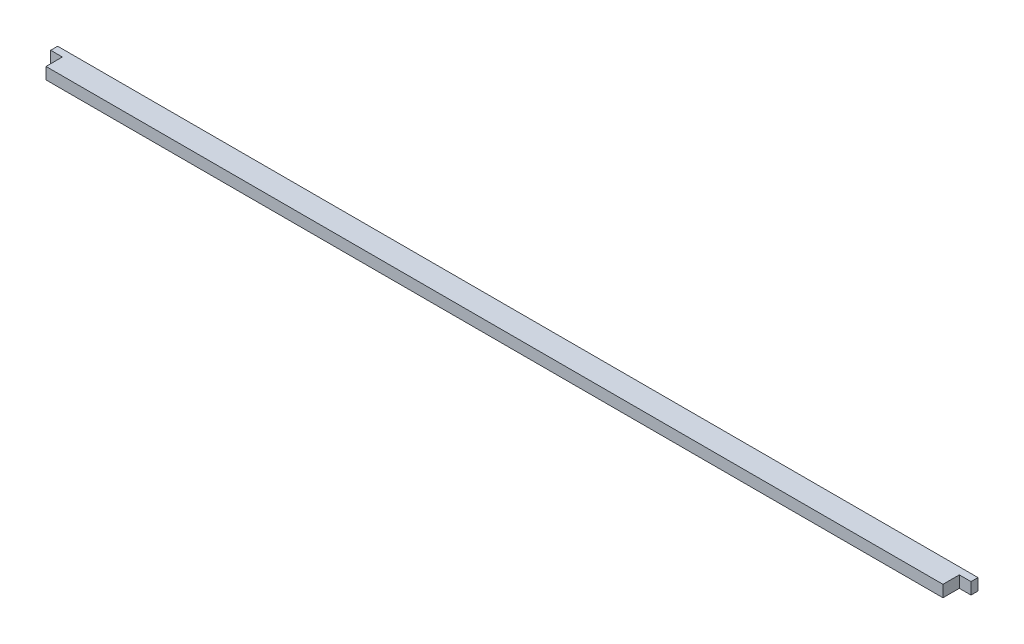
ISO-10303-21;
HEADER;
FILE_DESCRIPTION(('STEP AP214'),'2;1');
FILE_NAME('part.step','',(''),(''),'','','');
FILE_SCHEMA(('AUTOMOTIVE_DESIGN { 1 0 10303 214 1 1 1 1 }'));
ENDSEC;
DATA;
#1=APPLICATION_CONTEXT('core data for automotive mechanical design processes');
#2=APPLICATION_PROTOCOL_DEFINITION('international standard','automotive_design',2000,#1);
#3=PRODUCT_CONTEXT('',#1,'mechanical');
#4=PRODUCT('Part','Part','',(#3));
#5=PRODUCT_RELATED_PRODUCT_CATEGORY('part','',(#4));
#6=PRODUCT_DEFINITION_FORMATION('','',#4);
#7=PRODUCT_DEFINITION_CONTEXT('part definition',#1,'design');
#8=PRODUCT_DEFINITION('design','',#6,#7);
#9=PRODUCT_DEFINITION_SHAPE('','',#8);
#10=(LENGTH_UNIT() NAMED_UNIT(*) SI_UNIT(.MILLI.,.METRE.));
#11=(NAMED_UNIT(*) PLANE_ANGLE_UNIT() SI_UNIT($,.RADIAN.));
#12=(NAMED_UNIT(*) SI_UNIT($,.STERADIAN.) SOLID_ANGLE_UNIT());
#13=UNCERTAINTY_MEASURE_WITH_UNIT(LENGTH_MEASURE(1.E-05),#10,'distance_accuracy_value','');
#14=(GEOMETRIC_REPRESENTATION_CONTEXT(3) GLOBAL_UNCERTAINTY_ASSIGNED_CONTEXT((#13)) GLOBAL_UNIT_ASSIGNED_CONTEXT((#10,
#11,#12)) REPRESENTATION_CONTEXT('',''));
#15=CARTESIAN_POINT('',(0.,0.,0.));
#16=DIRECTION('',(0.,0.,1.));
#17=DIRECTION('',(1.,0.,0.));
#18=AXIS2_PLACEMENT_3D('',#15,#16,#17);
#19=CARTESIAN_POINT('',(-218.948369565217,5.,72.7078804347826));
#20=DIRECTION('',(1.,0.,0.));
#21=DIRECTION('',(0.,0.,-1.));
#22=AXIS2_PLACEMENT_3D('',#19,#20,#21);
#23=PLANE('',#22);
#24=DIRECTION('',(0.,0.,1.));
#25=VECTOR('',#24,1.);
#26=CARTESIAN_POINT('',(-218.948369565217,0.,72.7078804347826));
#27=LINE('',#26,#25);
#28=CARTESIAN_POINT('',(-218.948369565217,0.,72.7078804347826));
#29=VERTEX_POINT('',#28);
#30=CARTESIAN_POINT('',(-218.948369565217,0.,75.7078804347826));
#31=VERTEX_POINT('',#30);
#32=EDGE_CURVE('E119',#29,#31,#27,.T.);
#33=ORIENTED_EDGE('',*,*,#32,.T.);
#34=DIRECTION('',(0.,1.,0.));
#35=VECTOR('',#34,1.);
#36=CARTESIAN_POINT('',(-218.948369565217,0.,75.7078804347826));
#37=LINE('',#36,#35);
#38=CARTESIAN_POINT('',(-218.948369565217,5.,75.7078804347826));
#39=VERTEX_POINT('',#38);
#40=EDGE_CURVE('E124',#31,#39,#37,.T.);
#41=ORIENTED_EDGE('',*,*,#40,.T.);
#42=DIRECTION('',(0.,0.,1.));
#43=VECTOR('',#42,1.);
#44=CARTESIAN_POINT('',(-218.948369565217,5.,72.7078804347826));
#45=LINE('',#44,#43);
#46=CARTESIAN_POINT('',(-218.948369565217,5.,72.7078804347826));
#47=VERTEX_POINT('',#46);
#48=EDGE_CURVE('E128',#47,#39,#45,.T.);
#49=ORIENTED_EDGE('',*,*,#48,.F.);
#50=DIRECTION('',(0.,-1.,0.));
#51=VECTOR('',#50,1.);
#52=CARTESIAN_POINT('',(-218.948369565217,5.,72.7078804347826));
#53=LINE('',#52,#51);
#54=EDGE_CURVE('E40',#47,#29,#53,.T.);
#55=ORIENTED_EDGE('',*,*,#54,.T.);
#56=EDGE_LOOP('',(#33,#41,#49,#55));
#57=FACE_BOUND('',#56,.T.);
#58=ADVANCED_FACE('F33',(#57),#23,.F.);
#59=CARTESIAN_POINT('',(-218.948369565217,5.,82.7078804347826));
#60=DIRECTION('',(0.,0.,-1.));
#61=DIRECTION('',(-1.,0.,0.));
#62=AXIS2_PLACEMENT_3D('',#59,#60,#61);
#63=PLANE('',#62);
#64=DIRECTION('',(1.,0.,0.));
#65=VECTOR('',#64,1.);
#66=CARTESIAN_POINT('',(-218.948369565217,5.,82.7078804347826));
#67=LINE('',#66,#65);
#68=CARTESIAN_POINT('',(-213.948369565217,5.,82.7078804347826));
#69=VERTEX_POINT('',#68);
#70=CARTESIAN_POINT('',(170.051630434783,5.,82.7078804347826));
#71=VERTEX_POINT('',#70);
#72=EDGE_CURVE('E114',#69,#71,#67,.T.);
#73=ORIENTED_EDGE('',*,*,#72,.F.);
#74=DIRECTION('',(0.,1.,0.));
#75=VECTOR('',#74,1.);
#76=CARTESIAN_POINT('',(-213.948369565217,0.,82.7078804347826));
#77=LINE('',#76,#75);
#78=CARTESIAN_POINT('',(-213.948369565217,0.,82.7078804347826));
#79=VERTEX_POINT('',#78);
#80=EDGE_CURVE('E100',#79,#69,#77,.T.);
#81=ORIENTED_EDGE('',*,*,#80,.F.);
#82=DIRECTION('',(1.,0.,0.));
#83=VECTOR('',#82,1.);
#84=CARTESIAN_POINT('',(-218.948369565217,0.,82.7078804347826));
#85=LINE('',#84,#83);
#86=CARTESIAN_POINT('',(170.051630434783,0.,82.7078804347826));
#87=VERTEX_POINT('',#86);
#88=EDGE_CURVE('E112',#79,#87,#85,.T.);
#89=ORIENTED_EDGE('',*,*,#88,.T.);
#90=DIRECTION('',(0.,1.,0.));
#91=VECTOR('',#90,1.);
#92=CARTESIAN_POINT('',(170.051630434783,0.,82.7078804347826));
#93=LINE('',#92,#91);
#94=EDGE_CURVE('E147',#87,#71,#93,.T.);
#95=ORIENTED_EDGE('',*,*,#94,.T.);
#96=EDGE_LOOP('',(#73,#81,#89,#95));
#97=FACE_BOUND('',#96,.T.);
#98=ADVANCED_FACE('F110',(#97),#63,.F.);
#99=CARTESIAN_POINT('',(175.051630434783,5.,72.7078804347826));
#100=DIRECTION('',(-1.,0.,0.));
#101=DIRECTION('',(0.,0.,1.));
#102=AXIS2_PLACEMENT_3D('',#99,#100,#101);
#103=PLANE('',#102);
#104=DIRECTION('',(0.,0.,-1.));
#105=VECTOR('',#104,1.);
#106=CARTESIAN_POINT('',(175.051630434783,5.,72.7078804347826));
#107=LINE('',#106,#105);
#108=CARTESIAN_POINT('',(175.051630434783,5.,75.7078804347826));
#109=VERTEX_POINT('',#108);
#110=CARTESIAN_POINT('',(175.051630434783,5.,72.7078804347826));
#111=VERTEX_POINT('',#110);
#112=EDGE_CURVE('E135',#109,#111,#107,.T.);
#113=ORIENTED_EDGE('',*,*,#112,.F.);
#114=DIRECTION('',(0.,1.,0.));
#115=VECTOR('',#114,1.);
#116=CARTESIAN_POINT('',(175.051630434783,0.,75.7078804347826));
#117=LINE('',#116,#115);
#118=CARTESIAN_POINT('',(175.051630434783,0.,75.7078804347826));
#119=VERTEX_POINT('',#118);
#120=EDGE_CURVE('E143',#119,#109,#117,.T.);
#121=ORIENTED_EDGE('',*,*,#120,.F.);
#122=DIRECTION('',(0.,0.,-1.));
#123=VECTOR('',#122,1.);
#124=CARTESIAN_POINT('',(175.051630434783,0.,72.7078804347826));
#125=LINE('',#124,#123);
#126=CARTESIAN_POINT('',(175.051630434783,0.,72.7078804347826));
#127=VERTEX_POINT('',#126);
#128=EDGE_CURVE('E118',#119,#127,#125,.T.);
#129=ORIENTED_EDGE('',*,*,#128,.T.);
#130=DIRECTION('',(0.,-1.,0.));
#131=VECTOR('',#130,1.);
#132=CARTESIAN_POINT('',(175.051630434783,5.,72.7078804347826));
#133=LINE('',#132,#131);
#134=EDGE_CURVE('E11',#111,#127,#133,.T.);
#135=ORIENTED_EDGE('',*,*,#134,.F.);
#136=EDGE_LOOP('',(#113,#121,#129,#135));
#137=FACE_BOUND('',#136,.T.);
#138=ADVANCED_FACE('F182',(#137),#103,.F.);
#139=CARTESIAN_POINT('',(-218.948369565217,5.,72.7078804347826));
#140=DIRECTION('',(0.,0.,1.));
#141=DIRECTION('',(1.,0.,0.));
#142=AXIS2_PLACEMENT_3D('',#139,#140,#141);
#143=PLANE('',#142);
#144=DIRECTION('',(-1.,0.,0.));
#145=VECTOR('',#144,1.);
#146=CARTESIAN_POINT('',(-218.948369565217,0.,72.7078804347826));
#147=LINE('',#146,#145);
#148=EDGE_CURVE('E121',#127,#29,#147,.T.);
#149=ORIENTED_EDGE('',*,*,#148,.T.);
#150=ORIENTED_EDGE('',*,*,#54,.F.);
#151=DIRECTION('',(-1.,0.,0.));
#152=VECTOR('',#151,1.);
#153=CARTESIAN_POINT('',(-218.948369565217,5.,72.7078804347826));
#154=LINE('',#153,#152);
#155=EDGE_CURVE('E130',#111,#47,#154,.T.);
#156=ORIENTED_EDGE('',*,*,#155,.F.);
#157=ORIENTED_EDGE('',*,*,#134,.T.);
#158=EDGE_LOOP('',(#149,#150,#156,#157));
#159=FACE_BOUND('',#158,.T.);
#160=ADVANCED_FACE('F186',(#159),#143,.F.);
#161=CARTESIAN_POINT('',(0.,5.,0.));
#162=DIRECTION('',(0.,1.,0.));
#163=DIRECTION('',(0.,0.,1.));
#164=AXIS2_PLACEMENT_3D('',#161,#162,#163);
#165=PLANE('',#164);
#166=DIRECTION('',(-1.,0.,0.));
#167=VECTOR('',#166,1.);
#168=CARTESIAN_POINT('',(-218.948369565217,5.,75.7078804347826));
#169=LINE('',#168,#167);
#170=CARTESIAN_POINT('',(-213.948369565217,5.,75.7078804347826));
#171=VERTEX_POINT('',#170);
#172=EDGE_CURVE('E105',#171,#39,#169,.T.);
#173=ORIENTED_EDGE('',*,*,#172,.F.);
#174=DIRECTION('',(0.,0.,-1.));
#175=VECTOR('',#174,1.);
#176=CARTESIAN_POINT('',(-213.948369565217,5.,82.7078804347826));
#177=LINE('',#176,#175);
#178=EDGE_CURVE('E149',#69,#171,#177,.T.);
#179=ORIENTED_EDGE('',*,*,#178,.F.);
#180=ORIENTED_EDGE('',*,*,#72,.T.);
#181=DIRECTION('',(0.,0.,1.));
#182=VECTOR('',#181,1.);
#183=CARTESIAN_POINT('',(170.051630434783,5.,82.7078804347826));
#184=LINE('',#183,#182);
#185=CARTESIAN_POINT('',(170.051630434783,5.,75.7078804347826));
#186=VERTEX_POINT('',#185);
#187=EDGE_CURVE('E150',#186,#71,#184,.T.);
#188=ORIENTED_EDGE('',*,*,#187,.F.);
#189=DIRECTION('',(-1.,0.,0.));
#190=VECTOR('',#189,1.);
#191=CARTESIAN_POINT('',(175.051630434783,5.,75.7078804347826));
#192=LINE('',#191,#190);
#193=EDGE_CURVE('E153',#109,#186,#192,.T.);
#194=ORIENTED_EDGE('',*,*,#193,.F.);
#195=ORIENTED_EDGE('',*,*,#112,.T.);
#196=ORIENTED_EDGE('',*,*,#155,.T.);
#197=ORIENTED_EDGE('',*,*,#48,.T.);
#198=EDGE_LOOP('',(#173,#179,#180,#188,#194,#195,#196,#197));
#199=FACE_BOUND('',#198,.T.);
#200=ADVANCED_FACE('F165',(#199),#165,.T.);
#201=CARTESIAN_POINT('',(0.,0.,0.));
#202=DIRECTION('',(0.,1.,0.));
#203=DIRECTION('',(0.,0.,1.));
#204=AXIS2_PLACEMENT_3D('',#201,#202,#203);
#205=PLANE('',#204);
#206=DIRECTION('',(0.,0.,-1.));
#207=VECTOR('',#206,1.);
#208=CARTESIAN_POINT('',(-213.948369565217,0.,82.7078804347826));
#209=LINE('',#208,#207);
#210=CARTESIAN_POINT('',(-213.948369565217,0.,75.7078804347826));
#211=VERTEX_POINT('',#210);
#212=EDGE_CURVE('E96',#79,#211,#209,.T.);
#213=ORIENTED_EDGE('',*,*,#212,.T.);
#214=DIRECTION('',(-1.,0.,0.));
#215=VECTOR('',#214,1.);
#216=CARTESIAN_POINT('',(-218.948369565217,0.,75.7078804347826));
#217=LINE('',#216,#215);
#218=EDGE_CURVE('E47',#211,#31,#217,.T.);
#219=ORIENTED_EDGE('',*,*,#218,.T.);
#220=ORIENTED_EDGE('',*,*,#32,.F.);
#221=ORIENTED_EDGE('',*,*,#148,.F.);
#222=ORIENTED_EDGE('',*,*,#128,.F.);
#223=DIRECTION('',(-1.,0.,0.));
#224=VECTOR('',#223,1.);
#225=CARTESIAN_POINT('',(175.051630434783,0.,75.7078804347826));
#226=LINE('',#225,#224);
#227=CARTESIAN_POINT('',(170.051630434783,0.,75.7078804347826));
#228=VERTEX_POINT('',#227);
#229=EDGE_CURVE('E152',#119,#228,#226,.T.);
#230=ORIENTED_EDGE('',*,*,#229,.T.);
#231=DIRECTION('',(0.,0.,1.));
#232=VECTOR('',#231,1.);
#233=CARTESIAN_POINT('',(170.051630434783,0.,82.7078804347826));
#234=LINE('',#233,#232);
#235=EDGE_CURVE('E55',#228,#87,#234,.T.);
#236=ORIENTED_EDGE('',*,*,#235,.T.);
#237=ORIENTED_EDGE('',*,*,#88,.F.);
#238=EDGE_LOOP('',(#213,#219,#220,#221,#222,#230,#236,#237));
#239=FACE_BOUND('',#238,.T.);
#240=ADVANCED_FACE('F116',(#239),#205,.F.);
#241=CARTESIAN_POINT('',(170.051630434783,0.,82.7078804347826));
#242=DIRECTION('',(-1.,0.,0.));
#243=DIRECTION('',(0.,0.,1.));
#244=AXIS2_PLACEMENT_3D('',#241,#242,#243);
#245=PLANE('',#244);
#246=ORIENTED_EDGE('',*,*,#187,.T.);
#247=ORIENTED_EDGE('',*,*,#94,.F.);
#248=ORIENTED_EDGE('',*,*,#235,.F.);
#249=DIRECTION('',(0.,1.,0.));
#250=VECTOR('',#249,1.);
#251=CARTESIAN_POINT('',(170.051630434783,0.,75.7078804347826));
#252=LINE('',#251,#250);
#253=EDGE_CURVE('E145',#228,#186,#252,.T.);
#254=ORIENTED_EDGE('',*,*,#253,.T.);
#255=EDGE_LOOP('',(#246,#247,#248,#254));
#256=FACE_BOUND('',#255,.T.);
#257=ADVANCED_FACE('F175',(#256),#245,.F.);
#258=CARTESIAN_POINT('',(175.051630434783,0.,75.7078804347826));
#259=DIRECTION('',(0.,0.,-1.));
#260=DIRECTION('',(-1.,0.,0.));
#261=AXIS2_PLACEMENT_3D('',#258,#259,#260);
#262=PLANE('',#261);
#263=ORIENTED_EDGE('',*,*,#193,.T.);
#264=ORIENTED_EDGE('',*,*,#253,.F.);
#265=ORIENTED_EDGE('',*,*,#229,.F.);
#266=ORIENTED_EDGE('',*,*,#120,.T.);
#267=EDGE_LOOP('',(#263,#264,#265,#266));
#268=FACE_BOUND('',#267,.T.);
#269=ADVANCED_FACE('F168',(#268),#262,.F.);
#270=CARTESIAN_POINT('',(-218.948369565217,0.,75.7078804347826));
#271=DIRECTION('',(0.,0.,-1.));
#272=DIRECTION('',(-1.,0.,0.));
#273=AXIS2_PLACEMENT_3D('',#270,#271,#272);
#274=PLANE('',#273);
#275=ORIENTED_EDGE('',*,*,#172,.T.);
#276=ORIENTED_EDGE('',*,*,#40,.F.);
#277=ORIENTED_EDGE('',*,*,#218,.F.);
#278=DIRECTION('',(0.,1.,0.));
#279=VECTOR('',#278,1.);
#280=CARTESIAN_POINT('',(-213.948369565217,0.,75.7078804347826));
#281=LINE('',#280,#279);
#282=EDGE_CURVE('E102',#211,#171,#281,.T.);
#283=ORIENTED_EDGE('',*,*,#282,.T.);
#284=EDGE_LOOP('',(#275,#276,#277,#283));
#285=FACE_BOUND('',#284,.T.);
#286=ADVANCED_FACE('F166',(#285),#274,.F.);
#287=CARTESIAN_POINT('',(-213.948369565217,0.,82.7078804347826));
#288=DIRECTION('',(1.,0.,0.));
#289=DIRECTION('',(0.,0.,-1.));
#290=AXIS2_PLACEMENT_3D('',#287,#288,#289);
#291=PLANE('',#290);
#292=ORIENTED_EDGE('',*,*,#178,.T.);
#293=ORIENTED_EDGE('',*,*,#282,.F.);
#294=ORIENTED_EDGE('',*,*,#212,.F.);
#295=ORIENTED_EDGE('',*,*,#80,.T.);
#296=EDGE_LOOP('',(#292,#293,#294,#295));
#297=FACE_BOUND('',#296,.T.);
#298=ADVANCED_FACE('F99',(#297),#291,.F.);
#299=CLOSED_SHELL('',(#58,#98,#138,#160,#200,#240,#257,#269,#286,#298));
#300=MANIFOLD_SOLID_BREP('B2',#299);
#301=ADVANCED_BREP_SHAPE_REPRESENTATION('',(#18,#300),#14);
#302=SHAPE_DEFINITION_REPRESENTATION(#9,#301);
ENDSEC;
END-ISO-10303-21;
